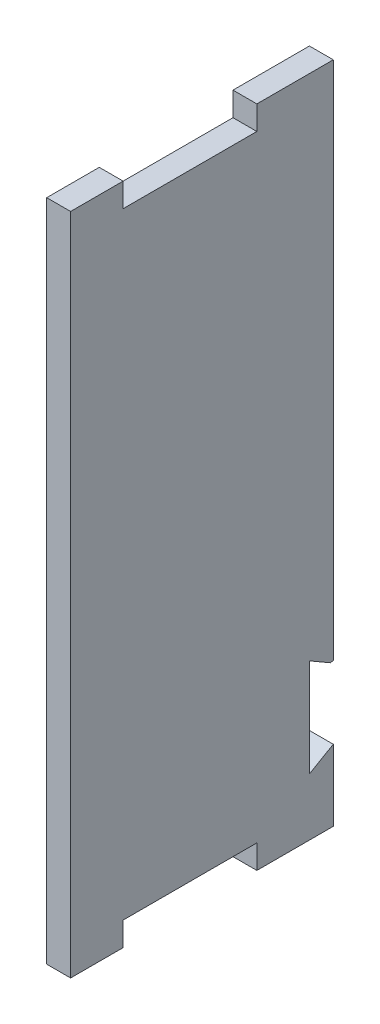
ISO-10303-21;
HEADER;
FILE_DESCRIPTION(('STEP AP214'),'2;1');
FILE_NAME('part.step','',(''),(''),'','','');
FILE_SCHEMA(('AUTOMOTIVE_DESIGN { 1 0 10303 214 1 1 1 1 }'));
ENDSEC;
DATA;
#1=APPLICATION_CONTEXT('core data for automotive mechanical design processes');
#2=APPLICATION_PROTOCOL_DEFINITION('international standard','automotive_design',2000,#1);
#3=PRODUCT_CONTEXT('',#1,'mechanical');
#4=PRODUCT('Part','Part','',(#3));
#5=PRODUCT_RELATED_PRODUCT_CATEGORY('part','',(#4));
#6=PRODUCT_DEFINITION_FORMATION('','',#4);
#7=PRODUCT_DEFINITION_CONTEXT('part definition',#1,'design');
#8=PRODUCT_DEFINITION('design','',#6,#7);
#9=PRODUCT_DEFINITION_SHAPE('','',#8);
#10=(LENGTH_UNIT() NAMED_UNIT(*) SI_UNIT(.MILLI.,.METRE.));
#11=(NAMED_UNIT(*) PLANE_ANGLE_UNIT() SI_UNIT($,.RADIAN.));
#12=(NAMED_UNIT(*) SI_UNIT($,.STERADIAN.) SOLID_ANGLE_UNIT());
#13=UNCERTAINTY_MEASURE_WITH_UNIT(LENGTH_MEASURE(1.E-05),#10,'distance_accuracy_value','');
#14=(GEOMETRIC_REPRESENTATION_CONTEXT(3) GLOBAL_UNCERTAINTY_ASSIGNED_CONTEXT((#13)) GLOBAL_UNIT_ASSIGNED_CONTEXT((#10,
#11,#12)) REPRESENTATION_CONTEXT('',''));
#15=CARTESIAN_POINT('',(0.,0.,0.));
#16=DIRECTION('',(0.,0.,1.));
#17=DIRECTION('',(1.,0.,0.));
#18=AXIS2_PLACEMENT_3D('',#15,#16,#17);
#19=CARTESIAN_POINT('',(5.,69.5,0.));
#20=DIRECTION('',(0.,-1.,0.));
#21=DIRECTION('',(0.,0.,-1.));
#22=AXIS2_PLACEMENT_3D('',#19,#20,#21);
#23=PLANE('',#22);
#24=DIRECTION('',(0.,0.,1.));
#25=VECTOR('',#24,1.);
#26=CARTESIAN_POINT('',(0.,69.5,0.));
#27=LINE('',#26,#25);
#28=CARTESIAN_POINT('',(0.,69.5,-30.));
#29=VERTEX_POINT('',#28);
#30=CARTESIAN_POINT('',(0.,69.5,-14.));
#31=VERTEX_POINT('',#30);
#32=EDGE_CURVE('E194',#29,#31,#27,.T.);
#33=ORIENTED_EDGE('',*,*,#32,.T.);
#34=DIRECTION('',(-1.,0.,0.));
#35=VECTOR('',#34,1.);
#36=CARTESIAN_POINT('',(5.,69.5,-14.));
#37=LINE('',#36,#35);
#38=CARTESIAN_POINT('',(5.,69.5,-14.));
#39=VERTEX_POINT('',#38);
#40=EDGE_CURVE('E11',#39,#31,#37,.T.);
#41=ORIENTED_EDGE('',*,*,#40,.F.);
#42=DIRECTION('',(0.,0.,1.));
#43=VECTOR('',#42,1.);
#44=CARTESIAN_POINT('',(5.,69.5,0.));
#45=LINE('',#44,#43);
#46=CARTESIAN_POINT('',(5.,69.5,-30.));
#47=VERTEX_POINT('',#46);
#48=EDGE_CURVE('E235',#47,#39,#45,.T.);
#49=ORIENTED_EDGE('',*,*,#48,.F.);
#50=DIRECTION('',(-1.,0.,0.));
#51=VECTOR('',#50,1.);
#52=CARTESIAN_POINT('',(5.,69.5,-30.));
#53=LINE('',#52,#51);
#54=EDGE_CURVE('E186',#47,#29,#53,.T.);
#55=ORIENTED_EDGE('',*,*,#54,.T.);
#56=EDGE_LOOP('',(#33,#41,#49,#55));
#57=FACE_BOUND('',#56,.T.);
#58=ADVANCED_FACE('F41',(#57),#23,.F.);
#59=CARTESIAN_POINT('',(5.,0.,-14.));
#60=DIRECTION('',(0.,0.,-1.));
#61=DIRECTION('',(-1.,0.,0.));
#62=AXIS2_PLACEMENT_3D('',#59,#60,#61);
#63=PLANE('',#62);
#64=DIRECTION('',(0.,-1.,0.));
#65=VECTOR('',#64,1.);
#66=CARTESIAN_POINT('',(0.,0.,-14.));
#67=LINE('',#66,#65);
#68=CARTESIAN_POINT('',(0.,64.5,-14.));
#69=VERTEX_POINT('',#68);
#70=EDGE_CURVE('E197',#31,#69,#67,.T.);
#71=ORIENTED_EDGE('',*,*,#70,.T.);
#72=DIRECTION('',(-1.,0.,0.));
#73=VECTOR('',#72,1.);
#74=CARTESIAN_POINT('',(5.,64.5,-14.));
#75=LINE('',#74,#73);
#76=CARTESIAN_POINT('',(5.,64.5,-14.));
#77=VERTEX_POINT('',#76);
#78=EDGE_CURVE('E49',#77,#69,#75,.T.);
#79=ORIENTED_EDGE('',*,*,#78,.F.);
#80=DIRECTION('',(0.,-1.,0.));
#81=VECTOR('',#80,1.);
#82=CARTESIAN_POINT('',(5.,0.,-14.));
#83=LINE('',#82,#81);
#84=EDGE_CURVE('E129',#39,#77,#83,.T.);
#85=ORIENTED_EDGE('',*,*,#84,.F.);
#86=ORIENTED_EDGE('',*,*,#40,.T.);
#87=EDGE_LOOP('',(#71,#79,#85,#86));
#88=FACE_BOUND('',#87,.T.);
#89=ADVANCED_FACE('F43',(#88),#63,.F.);
#90=CARTESIAN_POINT('',(5.,64.5,0.));
#91=DIRECTION('',(0.,-1.,0.));
#92=DIRECTION('',(0.,0.,-1.));
#93=AXIS2_PLACEMENT_3D('',#90,#91,#92);
#94=PLANE('',#93);
#95=DIRECTION('',(0.,0.,1.));
#96=VECTOR('',#95,1.);
#97=CARTESIAN_POINT('',(0.,64.5,0.));
#98=LINE('',#97,#96);
#99=CARTESIAN_POINT('',(0.,64.5,14.));
#100=VERTEX_POINT('',#99);
#101=EDGE_CURVE('E196',#69,#100,#98,.T.);
#102=ORIENTED_EDGE('',*,*,#101,.T.);
#103=DIRECTION('',(-1.,0.,0.));
#104=VECTOR('',#103,1.);
#105=CARTESIAN_POINT('',(5.,64.5,14.));
#106=LINE('',#105,#104);
#107=CARTESIAN_POINT('',(5.,64.5,14.));
#108=VERTEX_POINT('',#107);
#109=EDGE_CURVE('E256',#108,#100,#106,.T.);
#110=ORIENTED_EDGE('',*,*,#109,.F.);
#111=DIRECTION('',(0.,0.,1.));
#112=VECTOR('',#111,1.);
#113=CARTESIAN_POINT('',(5.,64.5,0.));
#114=LINE('',#113,#112);
#115=EDGE_CURVE('E264',#77,#108,#114,.T.);
#116=ORIENTED_EDGE('',*,*,#115,.F.);
#117=ORIENTED_EDGE('',*,*,#78,.T.);
#118=EDGE_LOOP('',(#102,#110,#116,#117));
#119=FACE_BOUND('',#118,.T.);
#120=ADVANCED_FACE('F262',(#119),#94,.F.);
#121=CARTESIAN_POINT('',(5.,0.,14.));
#122=DIRECTION('',(0.,0.,-1.));
#123=DIRECTION('',(-1.,0.,0.));
#124=AXIS2_PLACEMENT_3D('',#121,#122,#123);
#125=PLANE('',#124);
#126=DIRECTION('',(0.,-1.,0.));
#127=VECTOR('',#126,1.);
#128=CARTESIAN_POINT('',(0.,0.,14.));
#129=LINE('',#128,#127);
#130=CARTESIAN_POINT('',(0.,69.5,14.));
#131=VERTEX_POINT('',#130);
#132=EDGE_CURVE('E204',#131,#100,#129,.T.);
#133=ORIENTED_EDGE('',*,*,#132,.F.);
#134=DIRECTION('',(-1.,0.,0.));
#135=VECTOR('',#134,1.);
#136=CARTESIAN_POINT('',(5.,69.5,14.));
#137=LINE('',#136,#135);
#138=CARTESIAN_POINT('',(5.,69.5,14.));
#139=VERTEX_POINT('',#138);
#140=EDGE_CURVE('E251',#139,#131,#137,.T.);
#141=ORIENTED_EDGE('',*,*,#140,.F.);
#142=DIRECTION('',(0.,-1.,0.));
#143=VECTOR('',#142,1.);
#144=CARTESIAN_POINT('',(5.,0.,14.));
#145=LINE('',#144,#143);
#146=EDGE_CURVE('E273',#139,#108,#145,.T.);
#147=ORIENTED_EDGE('',*,*,#146,.T.);
#148=ORIENTED_EDGE('',*,*,#109,.T.);
#149=EDGE_LOOP('',(#133,#141,#147,#148));
#150=FACE_BOUND('',#149,.T.);
#151=ADVANCED_FACE('F272',(#150),#125,.T.);
#152=CARTESIAN_POINT('',(0.,69.5,25.));
#153=VERTEX_POINT('',#152);
#154=EDGE_CURVE('E200',#131,#153,#27,.T.);
#155=ORIENTED_EDGE('',*,*,#154,.T.);
#156=DIRECTION('',(-1.,0.,0.));
#157=VECTOR('',#156,1.);
#158=CARTESIAN_POINT('',(5.,69.5,25.));
#159=LINE('',#158,#157);
#160=CARTESIAN_POINT('',(5.,69.5,25.));
#161=VERTEX_POINT('',#160);
#162=EDGE_CURVE('E255',#161,#153,#159,.T.);
#163=ORIENTED_EDGE('',*,*,#162,.F.);
#164=EDGE_CURVE('E276',#139,#161,#45,.T.);
#165=ORIENTED_EDGE('',*,*,#164,.F.);
#166=ORIENTED_EDGE('',*,*,#140,.T.);
#167=EDGE_LOOP('',(#155,#163,#165,#166));
#168=FACE_BOUND('',#167,.T.);
#169=ADVANCED_FACE('F329',(#168),#23,.F.);
#170=CARTESIAN_POINT('',(5.,0.,25.));
#171=DIRECTION('',(0.,0.,1.));
#172=DIRECTION('',(1.,0.,0.));
#173=AXIS2_PLACEMENT_3D('',#170,#171,#172);
#174=PLANE('',#173);
#175=DIRECTION('',(0.,1.,0.));
#176=VECTOR('',#175,1.);
#177=CARTESIAN_POINT('',(0.,0.,25.));
#178=LINE('',#177,#176);
#179=CARTESIAN_POINT('',(0.,-69.5,25.));
#180=VERTEX_POINT('',#179);
#181=EDGE_CURVE('E201',#180,#153,#178,.T.);
#182=ORIENTED_EDGE('',*,*,#181,.F.);
#183=DIRECTION('',(-1.,0.,0.));
#184=VECTOR('',#183,1.);
#185=CARTESIAN_POINT('',(5.,-69.5,25.));
#186=LINE('',#185,#184);
#187=CARTESIAN_POINT('',(5.,-69.5,25.));
#188=VERTEX_POINT('',#187);
#189=EDGE_CURVE('E249',#188,#180,#186,.T.);
#190=ORIENTED_EDGE('',*,*,#189,.F.);
#191=DIRECTION('',(0.,1.,0.));
#192=VECTOR('',#191,1.);
#193=CARTESIAN_POINT('',(5.,0.,25.));
#194=LINE('',#193,#192);
#195=EDGE_CURVE('E279',#188,#161,#194,.T.);
#196=ORIENTED_EDGE('',*,*,#195,.T.);
#197=ORIENTED_EDGE('',*,*,#162,.T.);
#198=EDGE_LOOP('',(#182,#190,#196,#197));
#199=FACE_BOUND('',#198,.T.);
#200=ADVANCED_FACE('F331',(#199),#174,.T.);
#201=CARTESIAN_POINT('',(5.,-69.5,0.));
#202=DIRECTION('',(0.,-1.,0.));
#203=DIRECTION('',(0.,0.,-1.));
#204=AXIS2_PLACEMENT_3D('',#201,#202,#203);
#205=PLANE('',#204);
#206=DIRECTION('',(0.,0.,1.));
#207=VECTOR('',#206,1.);
#208=CARTESIAN_POINT('',(0.,-69.5,0.));
#209=LINE('',#208,#207);
#210=CARTESIAN_POINT('',(0.,-69.5,14.));
#211=VERTEX_POINT('',#210);
#212=EDGE_CURVE('E206',#211,#180,#209,.T.);
#213=ORIENTED_EDGE('',*,*,#212,.F.);
#214=DIRECTION('',(-1.,0.,0.));
#215=VECTOR('',#214,1.);
#216=CARTESIAN_POINT('',(5.,-69.5,14.));
#217=LINE('',#216,#215);
#218=CARTESIAN_POINT('',(5.,-69.5,14.));
#219=VERTEX_POINT('',#218);
#220=EDGE_CURVE('E247',#219,#211,#217,.T.);
#221=ORIENTED_EDGE('',*,*,#220,.F.);
#222=DIRECTION('',(0.,0.,1.));
#223=VECTOR('',#222,1.);
#224=CARTESIAN_POINT('',(5.,-69.5,0.));
#225=LINE('',#224,#223);
#226=EDGE_CURVE('E283',#219,#188,#225,.T.);
#227=ORIENTED_EDGE('',*,*,#226,.T.);
#228=ORIENTED_EDGE('',*,*,#189,.T.);
#229=EDGE_LOOP('',(#213,#221,#227,#228));
#230=FACE_BOUND('',#229,.T.);
#231=ADVANCED_FACE('F341',(#230),#205,.T.);
#232=CARTESIAN_POINT('',(5.,0.,14.));
#233=DIRECTION('',(0.,0.,1.));
#234=DIRECTION('',(1.,0.,0.));
#235=AXIS2_PLACEMENT_3D('',#232,#233,#234);
#236=PLANE('',#235);
#237=DIRECTION('',(0.,1.,0.));
#238=VECTOR('',#237,1.);
#239=CARTESIAN_POINT('',(0.,0.,14.));
#240=LINE('',#239,#238);
#241=CARTESIAN_POINT('',(0.,-64.5,14.));
#242=VERTEX_POINT('',#241);
#243=EDGE_CURVE('E211',#211,#242,#240,.T.);
#244=ORIENTED_EDGE('',*,*,#243,.T.);
#245=DIRECTION('',(-1.,0.,0.));
#246=VECTOR('',#245,1.);
#247=CARTESIAN_POINT('',(5.,-64.5,14.));
#248=LINE('',#247,#246);
#249=CARTESIAN_POINT('',(5.,-64.5,14.));
#250=VERTEX_POINT('',#249);
#251=EDGE_CURVE('E246',#250,#242,#248,.T.);
#252=ORIENTED_EDGE('',*,*,#251,.F.);
#253=DIRECTION('',(0.,1.,0.));
#254=VECTOR('',#253,1.);
#255=CARTESIAN_POINT('',(5.,0.,14.));
#256=LINE('',#255,#254);
#257=EDGE_CURVE('E287',#219,#250,#256,.T.);
#258=ORIENTED_EDGE('',*,*,#257,.F.);
#259=ORIENTED_EDGE('',*,*,#220,.T.);
#260=EDGE_LOOP('',(#244,#252,#258,#259));
#261=FACE_BOUND('',#260,.T.);
#262=ADVANCED_FACE('F352',(#261),#236,.F.);
#263=CARTESIAN_POINT('',(5.,-64.5,0.));
#264=DIRECTION('',(0.,-1.,0.));
#265=DIRECTION('',(0.,0.,-1.));
#266=AXIS2_PLACEMENT_3D('',#263,#264,#265);
#267=PLANE('',#266);
#268=DIRECTION('',(0.,0.,1.));
#269=VECTOR('',#268,1.);
#270=CARTESIAN_POINT('',(0.,-64.5,0.));
#271=LINE('',#270,#269);
#272=CARTESIAN_POINT('',(0.,-64.5,-14.));
#273=VERTEX_POINT('',#272);
#274=EDGE_CURVE('E215',#273,#242,#271,.T.);
#275=ORIENTED_EDGE('',*,*,#274,.F.);
#276=DIRECTION('',(-1.,0.,0.));
#277=VECTOR('',#276,1.);
#278=CARTESIAN_POINT('',(5.,-64.5,-14.));
#279=LINE('',#278,#277);
#280=CARTESIAN_POINT('',(5.,-64.5,-14.));
#281=VERTEX_POINT('',#280);
#282=EDGE_CURVE('E242',#281,#273,#279,.T.);
#283=ORIENTED_EDGE('',*,*,#282,.F.);
#284=DIRECTION('',(0.,0.,1.));
#285=VECTOR('',#284,1.);
#286=CARTESIAN_POINT('',(5.,-64.5,0.));
#287=LINE('',#286,#285);
#288=EDGE_CURVE('E293',#281,#250,#287,.T.);
#289=ORIENTED_EDGE('',*,*,#288,.T.);
#290=ORIENTED_EDGE('',*,*,#251,.T.);
#291=EDGE_LOOP('',(#275,#283,#289,#290));
#292=FACE_BOUND('',#291,.T.);
#293=ADVANCED_FACE('F365',(#292),#267,.T.);
#294=CARTESIAN_POINT('',(5.,0.,-14.));
#295=DIRECTION('',(0.,0.,1.));
#296=DIRECTION('',(1.,0.,0.));
#297=AXIS2_PLACEMENT_3D('',#294,#295,#296);
#298=PLANE('',#297);
#299=DIRECTION('',(0.,1.,0.));
#300=VECTOR('',#299,1.);
#301=CARTESIAN_POINT('',(0.,0.,-14.));
#302=LINE('',#301,#300);
#303=CARTESIAN_POINT('',(0.,-69.5,-14.));
#304=VERTEX_POINT('',#303);
#305=EDGE_CURVE('E219',#304,#273,#302,.T.);
#306=ORIENTED_EDGE('',*,*,#305,.F.);
#307=DIRECTION('',(-1.,0.,0.));
#308=VECTOR('',#307,1.);
#309=CARTESIAN_POINT('',(5.,-69.5,-14.));
#310=LINE('',#309,#308);
#311=CARTESIAN_POINT('',(5.,-69.5,-14.));
#312=VERTEX_POINT('',#311);
#313=EDGE_CURVE('E245',#312,#304,#310,.T.);
#314=ORIENTED_EDGE('',*,*,#313,.F.);
#315=DIRECTION('',(0.,1.,0.));
#316=VECTOR('',#315,1.);
#317=CARTESIAN_POINT('',(5.,0.,-14.));
#318=LINE('',#317,#316);
#319=EDGE_CURVE('E295',#312,#281,#318,.T.);
#320=ORIENTED_EDGE('',*,*,#319,.T.);
#321=ORIENTED_EDGE('',*,*,#282,.T.);
#322=EDGE_LOOP('',(#306,#314,#320,#321));
#323=FACE_BOUND('',#322,.T.);
#324=ADVANCED_FACE('F356',(#323),#298,.T.);
#325=CARTESIAN_POINT('',(0.,-69.5,-30.));
#326=VERTEX_POINT('',#325);
#327=EDGE_CURVE('E212',#326,#304,#209,.T.);
#328=ORIENTED_EDGE('',*,*,#327,.F.);
#329=DIRECTION('',(-1.,0.,0.));
#330=VECTOR('',#329,1.);
#331=CARTESIAN_POINT('',(5.,-69.5,-30.));
#332=LINE('',#331,#330);
#333=CARTESIAN_POINT('',(5.,-69.5,-30.));
#334=VERTEX_POINT('',#333);
#335=EDGE_CURVE('E239',#334,#326,#332,.T.);
#336=ORIENTED_EDGE('',*,*,#335,.F.);
#337=EDGE_CURVE('E290',#334,#312,#225,.T.);
#338=ORIENTED_EDGE('',*,*,#337,.T.);
#339=ORIENTED_EDGE('',*,*,#313,.T.);
#340=EDGE_LOOP('',(#328,#336,#338,#339));
#341=FACE_BOUND('',#340,.T.);
#342=ADVANCED_FACE('F363',(#341),#205,.T.);
#343=CARTESIAN_POINT('',(5.,0.,-30.));
#344=DIRECTION('',(0.,0.,1.));
#345=DIRECTION('',(1.,0.,0.));
#346=AXIS2_PLACEMENT_3D('',#343,#344,#345);
#347=PLANE('',#346);
#348=DIRECTION('',(0.,1.,0.));
#349=VECTOR('',#348,1.);
#350=CARTESIAN_POINT('',(0.,0.,-30.));
#351=LINE('',#350,#349);
#352=CARTESIAN_POINT('',(0.,-54.6132486540519,-30.));
#353=VERTEX_POINT('',#352);
#354=EDGE_CURVE('E223',#326,#353,#351,.T.);
#355=ORIENTED_EDGE('',*,*,#354,.T.);
#356=DIRECTION('',(-1.,0.,0.));
#357=VECTOR('',#356,1.);
#358=CARTESIAN_POINT('',(5.,-54.6132486540519,-30.));
#359=LINE('',#358,#357);
#360=CARTESIAN_POINT('',(5.,-54.6132486540519,-30.));
#361=VERTEX_POINT('',#360);
#362=EDGE_CURVE('E238',#361,#353,#359,.T.);
#363=ORIENTED_EDGE('',*,*,#362,.F.);
#364=DIRECTION('',(0.,1.,0.));
#365=VECTOR('',#364,1.);
#366=CARTESIAN_POINT('',(5.,0.,-30.));
#367=LINE('',#366,#365);
#368=EDGE_CURVE('E300',#334,#361,#367,.T.);
#369=ORIENTED_EDGE('',*,*,#368,.F.);
#370=ORIENTED_EDGE('',*,*,#335,.T.);
#371=EDGE_LOOP('',(#355,#363,#369,#370));
#372=FACE_BOUND('',#371,.T.);
#373=ADVANCED_FACE('F309',(#372),#347,.F.);
#374=CARTESIAN_POINT('',(5.,-53.9503175473055,-31.1482303588026));
#375=DIRECTION('',(0.,0.866025403784438,0.5));
#376=DIRECTION('',(0.,-0.5,0.866025403784438));
#377=AXIS2_PLACEMENT_3D('',#374,#375,#376);
#378=PLANE('',#377);
#379=DIRECTION('',(0.,0.5,-0.866025403784439));
#380=VECTOR('',#379,1.);
#381=CARTESIAN_POINT('',(0.,-53.9503175473055,-31.1482303588026));
#382=LINE('',#381,#380);
#383=CARTESIAN_POINT('',(0.,-57.5,-25.));
#384=VERTEX_POINT('',#383);
#385=EDGE_CURVE('E225',#384,#353,#382,.T.);
#386=ORIENTED_EDGE('',*,*,#385,.F.);
#387=DIRECTION('',(-1.,0.,0.));
#388=VECTOR('',#387,1.);
#389=CARTESIAN_POINT('',(5.,-57.5,-25.));
#390=LINE('',#389,#388);
#391=CARTESIAN_POINT('',(5.,-57.5,-25.));
#392=VERTEX_POINT('',#391);
#393=EDGE_CURVE('E236',#392,#384,#390,.T.);
#394=ORIENTED_EDGE('',*,*,#393,.F.);
#395=DIRECTION('',(0.,0.5,-0.866025403784439));
#396=VECTOR('',#395,1.);
#397=CARTESIAN_POINT('',(5.,-53.9503175473055,-31.1482303588026));
#398=LINE('',#397,#396);
#399=EDGE_CURVE('E299',#392,#361,#398,.T.);
#400=ORIENTED_EDGE('',*,*,#399,.T.);
#401=ORIENTED_EDGE('',*,*,#362,.T.);
#402=EDGE_LOOP('',(#386,#394,#400,#401));
#403=FACE_BOUND('',#402,.T.);
#404=ADVANCED_FACE('F303',(#403),#378,.T.);
#405=CARTESIAN_POINT('',(5.,0.,-25.));
#406=DIRECTION('',(0.,0.,1.));
#407=DIRECTION('',(1.,0.,0.));
#408=AXIS2_PLACEMENT_3D('',#405,#406,#407);
#409=PLANE('',#408);
#410=DIRECTION('',(0.,1.,0.));
#411=VECTOR('',#410,1.);
#412=CARTESIAN_POINT('',(0.,0.,-25.));
#413=LINE('',#412,#411);
#414=CARTESIAN_POINT('',(0.,-37.,-25.));
#415=VERTEX_POINT('',#414);
#416=EDGE_CURVE('E227',#384,#415,#413,.T.);
#417=ORIENTED_EDGE('',*,*,#416,.T.);
#418=DIRECTION('',(-1.,0.,0.));
#419=VECTOR('',#418,1.);
#420=CARTESIAN_POINT('',(5.,-37.,-25.));
#421=LINE('',#420,#419);
#422=CARTESIAN_POINT('',(5.,-37.,-25.));
#423=VERTEX_POINT('',#422);
#424=EDGE_CURVE('E183',#423,#415,#421,.T.);
#425=ORIENTED_EDGE('',*,*,#424,.F.);
#426=DIRECTION('',(0.,1.,0.));
#427=VECTOR('',#426,1.);
#428=CARTESIAN_POINT('',(5.,0.,-25.));
#429=LINE('',#428,#427);
#430=EDGE_CURVE('E174',#392,#423,#429,.T.);
#431=ORIENTED_EDGE('',*,*,#430,.F.);
#432=ORIENTED_EDGE('',*,*,#393,.T.);
#433=EDGE_LOOP('',(#417,#425,#431,#432));
#434=FACE_BOUND('',#433,.T.);
#435=ADVANCED_FACE('F317',(#434),#409,.F.);
#436=CARTESIAN_POINT('',(5.,-16.9246824526945,9.77146997001212));
#437=DIRECTION('',(0.,0.866025403784438,-0.5));
#438=DIRECTION('',(0.,0.5,0.866025403784439));
#439=AXIS2_PLACEMENT_3D('',#436,#437,#438);
#440=PLANE('',#439);
#441=DIRECTION('',(0.,-0.5,-0.866025403784439));
#442=VECTOR('',#441,1.);
#443=CARTESIAN_POINT('',(0.,-16.9246824526945,9.77146997001212));
#444=LINE('',#443,#442);
#445=CARTESIAN_POINT('',(0.,-39.5688740265611,-29.4494203322478));
#446=VERTEX_POINT('',#445);
#447=EDGE_CURVE('E182',#415,#446,#444,.T.);
#448=ORIENTED_EDGE('',*,*,#447,.T.);
#449=DIRECTION('',(-1.,0.,0.));
#450=VECTOR('',#449,1.);
#451=CARTESIAN_POINT('',(5.,-39.5688740265611,-29.4494203322478));
#452=LINE('',#451,#450);
#453=CARTESIAN_POINT('',(5.,-39.5688740265611,-29.4494203322478));
#454=VERTEX_POINT('',#453);
#455=EDGE_CURVE('E179',#454,#446,#452,.T.);
#456=ORIENTED_EDGE('',*,*,#455,.F.);
#457=DIRECTION('',(0.,-0.5,-0.866025403784439));
#458=VECTOR('',#457,1.);
#459=CARTESIAN_POINT('',(5.,-16.9246824526945,9.77146997001212));
#460=LINE('',#459,#458);
#461=EDGE_CURVE('E166',#423,#454,#460,.T.);
#462=ORIENTED_EDGE('',*,*,#461,.F.);
#463=ORIENTED_EDGE('',*,*,#424,.T.);
#464=EDGE_LOOP('',(#448,#456,#462,#463));
#465=FACE_BOUND('',#464,.T.);
#466=ADVANCED_FACE('F181',(#465),#440,.F.);
#467=CARTESIAN_POINT('',(5.,-44.4469700608575,-14.7023252159937));
#468=DIRECTION('',(0.,0.949407039411418,0.314048202535927));
#469=DIRECTION('',(0.,-0.314048202535927,0.949407039411418));
#470=AXIS2_PLACEMENT_3D('',#467,#468,#469);
#471=PLANE('',#470);
#472=DIRECTION('',(0.,0.314048202535927,-0.949407039411418));
#473=VECTOR('',#472,1.);
#474=CARTESIAN_POINT('',(0.,-44.4469700608575,-14.7023252159937));
#475=LINE('',#474,#473);
#476=CARTESIAN_POINT('',(0.,-39.3867513459481,-30.));
#477=VERTEX_POINT('',#476);
#478=EDGE_CURVE('E112',#446,#477,#475,.T.);
#479=ORIENTED_EDGE('',*,*,#478,.T.);
#480=DIRECTION('',(-1.,0.,0.));
#481=VECTOR('',#480,1.);
#482=CARTESIAN_POINT('',(5.,-39.3867513459481,-30.));
#483=LINE('',#482,#481);
#484=CARTESIAN_POINT('',(5.,-39.3867513459481,-30.));
#485=VERTEX_POINT('',#484);
#486=EDGE_CURVE('E184',#485,#477,#483,.T.);
#487=ORIENTED_EDGE('',*,*,#486,.F.);
#488=DIRECTION('',(0.,0.314048202535927,-0.949407039411418));
#489=VECTOR('',#488,1.);
#490=CARTESIAN_POINT('',(5.,-44.4469700608575,-14.7023252159937));
#491=LINE('',#490,#489);
#492=EDGE_CURVE('E175',#454,#485,#491,.T.);
#493=ORIENTED_EDGE('',*,*,#492,.F.);
#494=ORIENTED_EDGE('',*,*,#455,.T.);
#495=EDGE_LOOP('',(#479,#487,#493,#494));
#496=FACE_BOUND('',#495,.T.);
#497=ADVANCED_FACE('F190',(#496),#471,.F.);
#498=CARTESIAN_POINT('',(5.,0.,-30.));
#499=DIRECTION('',(0.,0.,1.));
#500=DIRECTION('',(1.,0.,0.));
#501=AXIS2_PLACEMENT_3D('',#498,#499,#500);
#502=PLANE('',#501);
#503=DIRECTION('',(0.,1.,0.));
#504=VECTOR('',#503,1.);
#505=CARTESIAN_POINT('',(0.,0.,-30.));
#506=LINE('',#505,#504);
#507=EDGE_CURVE('E119',#477,#29,#506,.T.);
#508=ORIENTED_EDGE('',*,*,#507,.T.);
#509=ORIENTED_EDGE('',*,*,#54,.F.);
#510=DIRECTION('',(0.,1.,0.));
#511=VECTOR('',#510,1.);
#512=CARTESIAN_POINT('',(5.,0.,-30.));
#513=LINE('',#512,#511);
#514=EDGE_CURVE('E59',#485,#47,#513,.T.);
#515=ORIENTED_EDGE('',*,*,#514,.F.);
#516=ORIENTED_EDGE('',*,*,#486,.T.);
#517=EDGE_LOOP('',(#508,#509,#515,#516));
#518=FACE_BOUND('',#517,.T.);
#519=ADVANCED_FACE('F426',(#518),#502,.F.);
#520=CARTESIAN_POINT('',(5.,0.,0.));
#521=DIRECTION('',(1.,0.,0.));
#522=DIRECTION('',(0.,0.,-1.));
#523=AXIS2_PLACEMENT_3D('',#520,#521,#522);
#524=PLANE('',#523);
#525=ORIENTED_EDGE('',*,*,#48,.T.);
#526=ORIENTED_EDGE('',*,*,#84,.T.);
#527=ORIENTED_EDGE('',*,*,#115,.T.);
#528=ORIENTED_EDGE('',*,*,#146,.F.);
#529=ORIENTED_EDGE('',*,*,#164,.T.);
#530=ORIENTED_EDGE('',*,*,#195,.F.);
#531=ORIENTED_EDGE('',*,*,#226,.F.);
#532=ORIENTED_EDGE('',*,*,#257,.T.);
#533=ORIENTED_EDGE('',*,*,#288,.F.);
#534=ORIENTED_EDGE('',*,*,#319,.F.);
#535=ORIENTED_EDGE('',*,*,#337,.F.);
#536=ORIENTED_EDGE('',*,*,#368,.T.);
#537=ORIENTED_EDGE('',*,*,#399,.F.);
#538=ORIENTED_EDGE('',*,*,#430,.T.);
#539=ORIENTED_EDGE('',*,*,#461,.T.);
#540=ORIENTED_EDGE('',*,*,#492,.T.);
#541=ORIENTED_EDGE('',*,*,#514,.T.);
#542=EDGE_LOOP('',(#525,#526,#527,#528,#529,#530,#531,#532,#533,#534,#535,#536,#537,#538,#539,
#540,#541));
#543=FACE_BOUND('',#542,.T.);
#544=ADVANCED_FACE('F167',(#543),#524,.T.);
#545=CARTESIAN_POINT('',(0.,0.,0.));
#546=DIRECTION('',(1.,0.,0.));
#547=DIRECTION('',(0.,0.,-1.));
#548=AXIS2_PLACEMENT_3D('',#545,#546,#547);
#549=PLANE('',#548);
#550=ORIENTED_EDGE('',*,*,#32,.F.);
#551=ORIENTED_EDGE('',*,*,#507,.F.);
#552=ORIENTED_EDGE('',*,*,#478,.F.);
#553=ORIENTED_EDGE('',*,*,#447,.F.);
#554=ORIENTED_EDGE('',*,*,#416,.F.);
#555=ORIENTED_EDGE('',*,*,#385,.T.);
#556=ORIENTED_EDGE('',*,*,#354,.F.);
#557=ORIENTED_EDGE('',*,*,#327,.T.);
#558=ORIENTED_EDGE('',*,*,#305,.T.);
#559=ORIENTED_EDGE('',*,*,#274,.T.);
#560=ORIENTED_EDGE('',*,*,#243,.F.);
#561=ORIENTED_EDGE('',*,*,#212,.T.);
#562=ORIENTED_EDGE('',*,*,#181,.T.);
#563=ORIENTED_EDGE('',*,*,#154,.F.);
#564=ORIENTED_EDGE('',*,*,#132,.T.);
#565=ORIENTED_EDGE('',*,*,#101,.F.);
#566=ORIENTED_EDGE('',*,*,#70,.F.);
#567=EDGE_LOOP('',(#550,#551,#552,#553,#554,#555,#556,#557,#558,#559,#560,#561,#562,#563,#564,
#565,#566));
#568=FACE_BOUND('',#567,.T.);
#569=ADVANCED_FACE('F268',(#568),#549,.F.);
#570=CLOSED_SHELL('',(#58,#89,#120,#151,#169,#200,#231,#262,#293,#324,#342,#373,#404,#435,#466,
#497,#519,#544,#569));
#571=MANIFOLD_SOLID_BREP('B2',#570);
#572=ADVANCED_BREP_SHAPE_REPRESENTATION('',(#18,#571),#14);
#573=SHAPE_DEFINITION_REPRESENTATION(#9,#572);
ENDSEC;
END-ISO-10303-21;
